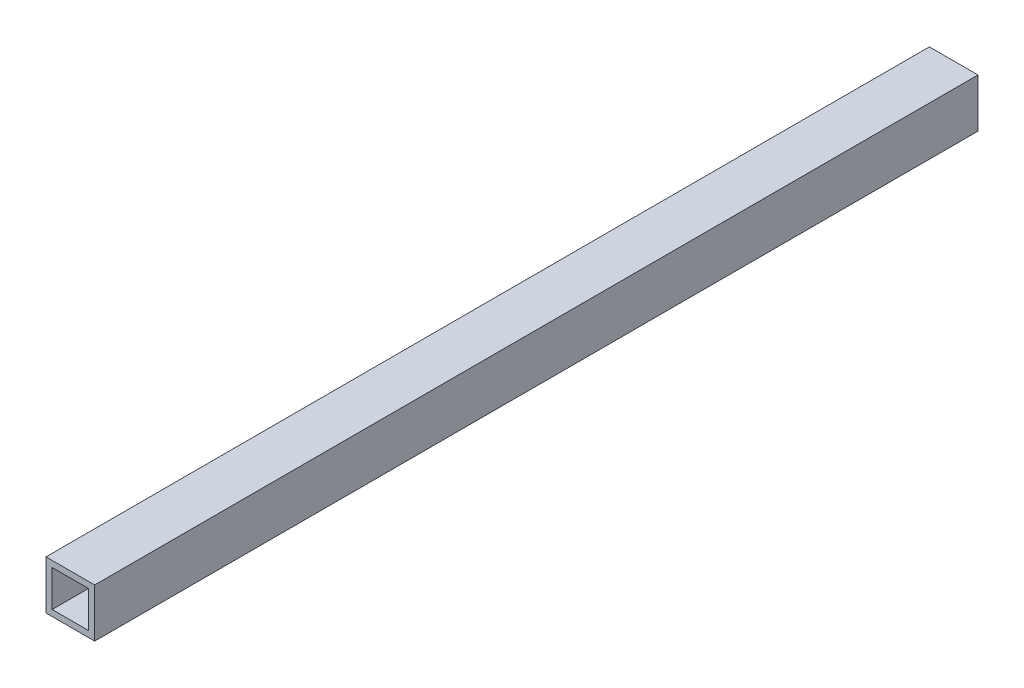
ISO-10303-21;
HEADER;
FILE_DESCRIPTION(('STEP AP214'),'2;1');
FILE_NAME('part.step','',(''),(''),'','','');
FILE_SCHEMA(('AUTOMOTIVE_DESIGN { 1 0 10303 214 1 1 1 1 }'));
ENDSEC;
DATA;
#1=APPLICATION_CONTEXT('core data for automotive mechanical design processes');
#2=APPLICATION_PROTOCOL_DEFINITION('international standard','automotive_design',2000,#1);
#3=PRODUCT_CONTEXT('',#1,'mechanical');
#4=PRODUCT('Part','Part','',(#3));
#5=PRODUCT_RELATED_PRODUCT_CATEGORY('part','',(#4));
#6=PRODUCT_DEFINITION_FORMATION('','',#4);
#7=PRODUCT_DEFINITION_CONTEXT('part definition',#1,'design');
#8=PRODUCT_DEFINITION('design','',#6,#7);
#9=PRODUCT_DEFINITION_SHAPE('','',#8);
#10=(LENGTH_UNIT() NAMED_UNIT(*) SI_UNIT(.MILLI.,.METRE.));
#11=(NAMED_UNIT(*) PLANE_ANGLE_UNIT() SI_UNIT($,.RADIAN.));
#12=(NAMED_UNIT(*) SI_UNIT($,.STERADIAN.) SOLID_ANGLE_UNIT());
#13=UNCERTAINTY_MEASURE_WITH_UNIT(LENGTH_MEASURE(1.E-05),#10,'distance_accuracy_value','');
#14=(GEOMETRIC_REPRESENTATION_CONTEXT(3) GLOBAL_UNCERTAINTY_ASSIGNED_CONTEXT((#13)) GLOBAL_UNIT_ASSIGNED_CONTEXT((#10,
#11,#12)) REPRESENTATION_CONTEXT('',''));
#15=CARTESIAN_POINT('',(0.,0.,0.));
#16=DIRECTION('',(0.,0.,1.));
#17=DIRECTION('',(1.,0.,0.));
#18=AXIS2_PLACEMENT_3D('',#15,#16,#17);
#19=CARTESIAN_POINT('',(0.,0.,110.));
#20=DIRECTION('',(0.,0.,1.));
#21=DIRECTION('',(1.,0.,0.));
#22=AXIS2_PLACEMENT_3D('',#19,#20,#21);
#23=PLANE('',#22);
#24=DIRECTION('',(0.,1.,0.));
#25=VECTOR('',#24,1.);
#26=CARTESIAN_POINT('',(6.06,6.06,110.));
#27=LINE('',#26,#25);
#28=CARTESIAN_POINT('',(6.06,-6.06,110.));
#29=VERTEX_POINT('',#28);
#30=CARTESIAN_POINT('',(6.06,6.06,110.));
#31=VERTEX_POINT('',#30);
#32=EDGE_CURVE('E134',#29,#31,#27,.T.);
#33=ORIENTED_EDGE('',*,*,#32,.T.);
#34=DIRECTION('',(-1.,0.,0.));
#35=VECTOR('',#34,1.);
#36=CARTESIAN_POINT('',(-6.06,6.06,110.));
#37=LINE('',#36,#35);
#38=CARTESIAN_POINT('',(-6.06,6.06,110.));
#39=VERTEX_POINT('',#38);
#40=EDGE_CURVE('E137',#31,#39,#37,.T.);
#41=ORIENTED_EDGE('',*,*,#40,.T.);
#42=DIRECTION('',(0.,-1.,0.));
#43=VECTOR('',#42,1.);
#44=CARTESIAN_POINT('',(-6.06,6.06,110.));
#45=LINE('',#44,#43);
#46=CARTESIAN_POINT('',(-6.06,-6.06,110.));
#47=VERTEX_POINT('',#46);
#48=EDGE_CURVE('E140',#39,#47,#45,.T.);
#49=ORIENTED_EDGE('',*,*,#48,.T.);
#50=DIRECTION('',(1.,0.,0.));
#51=VECTOR('',#50,1.);
#52=CARTESIAN_POINT('',(-6.06,-6.06,110.));
#53=LINE('',#52,#51);
#54=EDGE_CURVE('E142',#47,#29,#53,.T.);
#55=ORIENTED_EDGE('',*,*,#54,.T.);
#56=EDGE_LOOP('',(#33,#41,#49,#55));
#57=FACE_BOUND('',#56,.T.);
#58=DIRECTION('',(-1.,0.,0.));
#59=VECTOR('',#58,1.);
#60=CARTESIAN_POINT('',(-4.53,4.53,110.));
#61=LINE('',#60,#59);
#62=CARTESIAN_POINT('',(4.53,4.53,110.));
#63=VERTEX_POINT('',#62);
#64=CARTESIAN_POINT('',(-4.53,4.53,110.));
#65=VERTEX_POINT('',#64);
#66=EDGE_CURVE('E106',#63,#65,#61,.T.);
#67=ORIENTED_EDGE('',*,*,#66,.F.);
#68=DIRECTION('',(0.,1.,0.));
#69=VECTOR('',#68,1.);
#70=CARTESIAN_POINT('',(4.53,4.53,110.));
#71=LINE('',#70,#69);
#72=CARTESIAN_POINT('',(4.53,-4.53,110.));
#73=VERTEX_POINT('',#72);
#74=EDGE_CURVE('E98',#73,#63,#71,.T.);
#75=ORIENTED_EDGE('',*,*,#74,.F.);
#76=DIRECTION('',(1.,0.,0.));
#77=VECTOR('',#76,1.);
#78=CARTESIAN_POINT('',(-4.53,-4.53,110.));
#79=LINE('',#78,#77);
#80=CARTESIAN_POINT('',(-4.53,-4.53,110.));
#81=VERTEX_POINT('',#80);
#82=EDGE_CURVE('E120',#81,#73,#79,.T.);
#83=ORIENTED_EDGE('',*,*,#82,.F.);
#84=DIRECTION('',(0.,-1.,0.));
#85=VECTOR('',#84,1.);
#86=CARTESIAN_POINT('',(-4.53,4.53,110.));
#87=LINE('',#86,#85);
#88=EDGE_CURVE('E118',#65,#81,#87,.T.);
#89=ORIENTED_EDGE('',*,*,#88,.F.);
#90=EDGE_LOOP('',(#67,#75,#83,#89));
#91=FACE_BOUND('',#90,.T.);
#92=ADVANCED_FACE('F33',(#57,#91),#23,.T.);
#93=CARTESIAN_POINT('',(0.,0.,-110.));
#94=DIRECTION('',(0.,0.,1.));
#95=DIRECTION('',(1.,0.,0.));
#96=AXIS2_PLACEMENT_3D('',#93,#94,#95);
#97=PLANE('',#96);
#98=DIRECTION('',(0.,1.,0.));
#99=VECTOR('',#98,1.);
#100=CARTESIAN_POINT('',(6.06,6.06,-110.));
#101=LINE('',#100,#99);
#102=CARTESIAN_POINT('',(6.06,-6.06,-110.));
#103=VERTEX_POINT('',#102);
#104=CARTESIAN_POINT('',(6.06,6.06,-110.));
#105=VERTEX_POINT('',#104);
#106=EDGE_CURVE('E114',#103,#105,#101,.T.);
#107=ORIENTED_EDGE('',*,*,#106,.F.);
#108=DIRECTION('',(1.,0.,0.));
#109=VECTOR('',#108,1.);
#110=CARTESIAN_POINT('',(-6.06,-6.06,-110.));
#111=LINE('',#110,#109);
#112=CARTESIAN_POINT('',(-6.06,-6.06,-110.));
#113=VERTEX_POINT('',#112);
#114=EDGE_CURVE('E138',#113,#103,#111,.T.);
#115=ORIENTED_EDGE('',*,*,#114,.F.);
#116=DIRECTION('',(0.,-1.,0.));
#117=VECTOR('',#116,1.);
#118=CARTESIAN_POINT('',(-6.06,6.06,-110.));
#119=LINE('',#118,#117);
#120=CARTESIAN_POINT('',(-6.06,6.06,-110.));
#121=VERTEX_POINT('',#120);
#122=EDGE_CURVE('E149',#121,#113,#119,.T.);
#123=ORIENTED_EDGE('',*,*,#122,.F.);
#124=DIRECTION('',(-1.,0.,0.));
#125=VECTOR('',#124,1.);
#126=CARTESIAN_POINT('',(-6.06,6.06,-110.));
#127=LINE('',#126,#125);
#128=EDGE_CURVE('E147',#105,#121,#127,.T.);
#129=ORIENTED_EDGE('',*,*,#128,.F.);
#130=EDGE_LOOP('',(#107,#115,#123,#129));
#131=FACE_BOUND('',#130,.T.);
#132=DIRECTION('',(0.,1.,0.));
#133=VECTOR('',#132,1.);
#134=CARTESIAN_POINT('',(4.53,4.53,-110.));
#135=LINE('',#134,#133);
#136=CARTESIAN_POINT('',(4.53,-4.53,-110.));
#137=VERTEX_POINT('',#136);
#138=CARTESIAN_POINT('',(4.53,4.53,-110.));
#139=VERTEX_POINT('',#138);
#140=EDGE_CURVE('E56',#137,#139,#135,.T.);
#141=ORIENTED_EDGE('',*,*,#140,.T.);
#142=DIRECTION('',(-1.,0.,0.));
#143=VECTOR('',#142,1.);
#144=CARTESIAN_POINT('',(-4.53,4.53,-110.));
#145=LINE('',#144,#143);
#146=CARTESIAN_POINT('',(-4.53,4.53,-110.));
#147=VERTEX_POINT('',#146);
#148=EDGE_CURVE('E113',#139,#147,#145,.T.);
#149=ORIENTED_EDGE('',*,*,#148,.T.);
#150=DIRECTION('',(0.,-1.,0.));
#151=VECTOR('',#150,1.);
#152=CARTESIAN_POINT('',(-4.53,4.53,-110.));
#153=LINE('',#152,#151);
#154=CARTESIAN_POINT('',(-4.53,-4.53,-110.));
#155=VERTEX_POINT('',#154);
#156=EDGE_CURVE('E126',#147,#155,#153,.T.);
#157=ORIENTED_EDGE('',*,*,#156,.T.);
#158=DIRECTION('',(1.,0.,0.));
#159=VECTOR('',#158,1.);
#160=CARTESIAN_POINT('',(-4.53,-4.53,-110.));
#161=LINE('',#160,#159);
#162=EDGE_CURVE('E107',#155,#137,#161,.T.);
#163=ORIENTED_EDGE('',*,*,#162,.T.);
#164=EDGE_LOOP('',(#141,#149,#157,#163));
#165=FACE_BOUND('',#164,.T.);
#166=ADVANCED_FACE('F167',(#131,#165),#97,.F.);
#167=CARTESIAN_POINT('',(6.06,6.06,110.));
#168=DIRECTION('',(-1.,0.,0.));
#169=DIRECTION('',(0.,0.,1.));
#170=AXIS2_PLACEMENT_3D('',#167,#168,#169);
#171=PLANE('',#170);
#172=ORIENTED_EDGE('',*,*,#106,.T.);
#173=DIRECTION('',(0.,0.,-1.));
#174=VECTOR('',#173,1.);
#175=CARTESIAN_POINT('',(6.06,6.06,110.));
#176=LINE('',#175,#174);
#177=EDGE_CURVE('E11',#31,#105,#176,.T.);
#178=ORIENTED_EDGE('',*,*,#177,.F.);
#179=ORIENTED_EDGE('',*,*,#32,.F.);
#180=DIRECTION('',(0.,0.,-1.));
#181=VECTOR('',#180,1.);
#182=CARTESIAN_POINT('',(6.06,-6.06,110.));
#183=LINE('',#182,#181);
#184=EDGE_CURVE('E144',#29,#103,#183,.T.);
#185=ORIENTED_EDGE('',*,*,#184,.T.);
#186=EDGE_LOOP('',(#172,#178,#179,#185));
#187=FACE_BOUND('',#186,.T.);
#188=ADVANCED_FACE('F35',(#187),#171,.F.);
#189=CARTESIAN_POINT('',(-6.06,6.06,110.));
#190=DIRECTION('',(0.,-1.,0.));
#191=DIRECTION('',(0.,0.,-1.));
#192=AXIS2_PLACEMENT_3D('',#189,#190,#191);
#193=PLANE('',#192);
#194=ORIENTED_EDGE('',*,*,#128,.T.);
#195=DIRECTION('',(0.,0.,-1.));
#196=VECTOR('',#195,1.);
#197=CARTESIAN_POINT('',(-6.06,6.06,110.));
#198=LINE('',#197,#196);
#199=EDGE_CURVE('E41',#39,#121,#198,.T.);
#200=ORIENTED_EDGE('',*,*,#199,.F.);
#201=ORIENTED_EDGE('',*,*,#40,.F.);
#202=ORIENTED_EDGE('',*,*,#177,.T.);
#203=EDGE_LOOP('',(#194,#200,#201,#202));
#204=FACE_BOUND('',#203,.T.);
#205=ADVANCED_FACE('F177',(#204),#193,.F.);
#206=CARTESIAN_POINT('',(-6.06,6.06,110.));
#207=DIRECTION('',(1.,0.,0.));
#208=DIRECTION('',(0.,0.,-1.));
#209=AXIS2_PLACEMENT_3D('',#206,#207,#208);
#210=PLANE('',#209);
#211=ORIENTED_EDGE('',*,*,#122,.T.);
#212=DIRECTION('',(0.,0.,-1.));
#213=VECTOR('',#212,1.);
#214=CARTESIAN_POINT('',(-6.06,-6.06,110.));
#215=LINE('',#214,#213);
#216=EDGE_CURVE('E154',#47,#113,#215,.T.);
#217=ORIENTED_EDGE('',*,*,#216,.F.);
#218=ORIENTED_EDGE('',*,*,#48,.F.);
#219=ORIENTED_EDGE('',*,*,#199,.T.);
#220=EDGE_LOOP('',(#211,#217,#218,#219));
#221=FACE_BOUND('',#220,.T.);
#222=ADVANCED_FACE('F161',(#221),#210,.F.);
#223=CARTESIAN_POINT('',(-6.06,-6.06,110.));
#224=DIRECTION('',(0.,1.,0.));
#225=DIRECTION('',(0.,0.,1.));
#226=AXIS2_PLACEMENT_3D('',#223,#224,#225);
#227=PLANE('',#226);
#228=ORIENTED_EDGE('',*,*,#114,.T.);
#229=ORIENTED_EDGE('',*,*,#184,.F.);
#230=ORIENTED_EDGE('',*,*,#54,.F.);
#231=ORIENTED_EDGE('',*,*,#216,.T.);
#232=EDGE_LOOP('',(#228,#229,#230,#231));
#233=FACE_BOUND('',#232,.T.);
#234=ADVANCED_FACE('F171',(#233),#227,.F.);
#235=CARTESIAN_POINT('',(4.53,4.53,110.));
#236=DIRECTION('',(-1.,0.,0.));
#237=DIRECTION('',(0.,0.,1.));
#238=AXIS2_PLACEMENT_3D('',#235,#236,#237);
#239=PLANE('',#238);
#240=ORIENTED_EDGE('',*,*,#140,.F.);
#241=DIRECTION('',(0.,0.,-1.));
#242=VECTOR('',#241,1.);
#243=CARTESIAN_POINT('',(4.53,-4.53,110.));
#244=LINE('',#243,#242);
#245=EDGE_CURVE('E102',#73,#137,#244,.T.);
#246=ORIENTED_EDGE('',*,*,#245,.F.);
#247=ORIENTED_EDGE('',*,*,#74,.T.);
#248=DIRECTION('',(0.,0.,-1.));
#249=VECTOR('',#248,1.);
#250=CARTESIAN_POINT('',(4.53,4.53,110.));
#251=LINE('',#250,#249);
#252=EDGE_CURVE('E101',#63,#139,#251,.T.);
#253=ORIENTED_EDGE('',*,*,#252,.T.);
#254=EDGE_LOOP('',(#240,#246,#247,#253));
#255=FACE_BOUND('',#254,.T.);
#256=ADVANCED_FACE('F100',(#255),#239,.T.);
#257=CARTESIAN_POINT('',(-4.53,4.53,110.));
#258=DIRECTION('',(0.,-1.,0.));
#259=DIRECTION('',(0.,0.,-1.));
#260=AXIS2_PLACEMENT_3D('',#257,#258,#259);
#261=PLANE('',#260);
#262=ORIENTED_EDGE('',*,*,#148,.F.);
#263=ORIENTED_EDGE('',*,*,#252,.F.);
#264=ORIENTED_EDGE('',*,*,#66,.T.);
#265=DIRECTION('',(0.,0.,-1.));
#266=VECTOR('',#265,1.);
#267=CARTESIAN_POINT('',(-4.53,4.53,110.));
#268=LINE('',#267,#266);
#269=EDGE_CURVE('E115',#65,#147,#268,.T.);
#270=ORIENTED_EDGE('',*,*,#269,.T.);
#271=EDGE_LOOP('',(#262,#263,#264,#270));
#272=FACE_BOUND('',#271,.T.);
#273=ADVANCED_FACE('F110',(#272),#261,.T.);
#274=CARTESIAN_POINT('',(-4.53,4.53,110.));
#275=DIRECTION('',(1.,0.,0.));
#276=DIRECTION('',(0.,0.,-1.));
#277=AXIS2_PLACEMENT_3D('',#274,#275,#276);
#278=PLANE('',#277);
#279=ORIENTED_EDGE('',*,*,#156,.F.);
#280=ORIENTED_EDGE('',*,*,#269,.F.);
#281=ORIENTED_EDGE('',*,*,#88,.T.);
#282=DIRECTION('',(0.,0.,-1.));
#283=VECTOR('',#282,1.);
#284=CARTESIAN_POINT('',(-4.53,-4.53,110.));
#285=LINE('',#284,#283);
#286=EDGE_CURVE('E48',#81,#155,#285,.T.);
#287=ORIENTED_EDGE('',*,*,#286,.T.);
#288=EDGE_LOOP('',(#279,#280,#281,#287));
#289=FACE_BOUND('',#288,.T.);
#290=ADVANCED_FACE('F200',(#289),#278,.T.);
#291=CARTESIAN_POINT('',(-4.53,-4.53,110.));
#292=DIRECTION('',(0.,1.,0.));
#293=DIRECTION('',(0.,0.,1.));
#294=AXIS2_PLACEMENT_3D('',#291,#292,#293);
#295=PLANE('',#294);
#296=ORIENTED_EDGE('',*,*,#162,.F.);
#297=ORIENTED_EDGE('',*,*,#286,.F.);
#298=ORIENTED_EDGE('',*,*,#82,.T.);
#299=ORIENTED_EDGE('',*,*,#245,.T.);
#300=EDGE_LOOP('',(#296,#297,#298,#299));
#301=FACE_BOUND('',#300,.T.);
#302=ADVANCED_FACE('F204',(#301),#295,.T.);
#303=CLOSED_SHELL('',(#92,#166,#188,#205,#222,#234,#256,#273,#290,#302));
#304=MANIFOLD_SOLID_BREP('B2',#303);
#305=ADVANCED_BREP_SHAPE_REPRESENTATION('',(#18,#304),#14);
#306=SHAPE_DEFINITION_REPRESENTATION(#9,#305);
ENDSEC;
END-ISO-10303-21;
